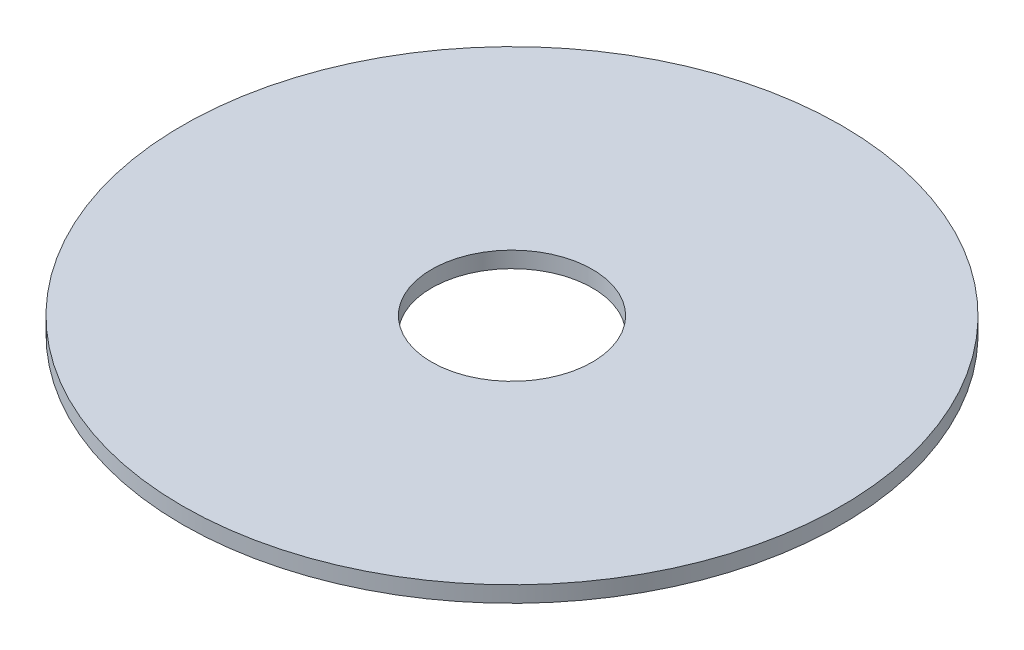
ISO-10303-21;
HEADER;
FILE_DESCRIPTION(('STEP AP214'),'2;1');
FILE_NAME('part.step','',(''),(''),'','','');
FILE_SCHEMA(('AUTOMOTIVE_DESIGN { 1 0 10303 214 1 1 1 1 }'));
ENDSEC;
DATA;
#1=APPLICATION_CONTEXT('core data for automotive mechanical design processes');
#2=APPLICATION_PROTOCOL_DEFINITION('international standard','automotive_design',2000,#1);
#3=PRODUCT_CONTEXT('',#1,'mechanical');
#4=PRODUCT('Part','Part','',(#3));
#5=PRODUCT_RELATED_PRODUCT_CATEGORY('part','',(#4));
#6=PRODUCT_DEFINITION_FORMATION('','',#4);
#7=PRODUCT_DEFINITION_CONTEXT('part definition',#1,'design');
#8=PRODUCT_DEFINITION('design','',#6,#7);
#9=PRODUCT_DEFINITION_SHAPE('','',#8);
#10=(LENGTH_UNIT() NAMED_UNIT(*) SI_UNIT(.MILLI.,.METRE.));
#11=(NAMED_UNIT(*) PLANE_ANGLE_UNIT() SI_UNIT($,.RADIAN.));
#12=(NAMED_UNIT(*) SI_UNIT($,.STERADIAN.) SOLID_ANGLE_UNIT());
#13=UNCERTAINTY_MEASURE_WITH_UNIT(LENGTH_MEASURE(1.E-05),#10,'distance_accuracy_value','');
#14=(GEOMETRIC_REPRESENTATION_CONTEXT(3) GLOBAL_UNCERTAINTY_ASSIGNED_CONTEXT((#13)) GLOBAL_UNIT_ASSIGNED_CONTEXT((#10,
#11,#12)) REPRESENTATION_CONTEXT('',''));
#15=CARTESIAN_POINT('',(0.,0.,0.));
#16=DIRECTION('',(0.,0.,1.));
#17=DIRECTION('',(1.,0.,0.));
#18=AXIS2_PLACEMENT_3D('',#15,#16,#17);
#19=CARTESIAN_POINT('',(0.,2.,0.));
#20=DIRECTION('',(0.,1.,0.));
#21=DIRECTION('',(0.,0.,1.));
#22=AXIS2_PLACEMENT_3D('',#19,#20,#21);
#23=PLANE('',#22);
#24=CARTESIAN_POINT('',(0.,2.,0.));
#25=DIRECTION('',(0.,1.,0.));
#26=DIRECTION('',(0.,0.,1.));
#27=AXIS2_PLACEMENT_3D('',#24,#25,#26);
#28=CIRCLE('',#27,41.);
#29=CARTESIAN_POINT('',(0.,2.,41.));
#30=VERTEX_POINT('',#29);
#31=EDGE_CURVE('E10',#30,#30,#28,.T.);
#32=ORIENTED_EDGE('',*,*,#31,.T.);
#33=EDGE_LOOP('',(#32));
#34=FACE_BOUND('',#33,.T.);
#35=CARTESIAN_POINT('',(0.,2.,0.));
#36=DIRECTION('',(0.,1.,0.));
#37=DIRECTION('',(0.,0.,1.));
#38=AXIS2_PLACEMENT_3D('',#35,#36,#37);
#39=CIRCLE('',#38,10.);
#40=CARTESIAN_POINT('',(0.,2.,10.));
#41=VERTEX_POINT('',#40);
#42=EDGE_CURVE('E42',#41,#41,#39,.T.);
#43=ORIENTED_EDGE('',*,*,#42,.F.);
#44=EDGE_LOOP('',(#43));
#45=FACE_BOUND('',#44,.T.);
#46=ADVANCED_FACE('F31',(#34,#45),#23,.T.);
#47=CARTESIAN_POINT('',(0.,0.,0.));
#48=DIRECTION('',(0.,1.,0.));
#49=DIRECTION('',(0.,0.,1.));
#50=AXIS2_PLACEMENT_3D('',#47,#48,#49);
#51=PLANE('',#50);
#52=CARTESIAN_POINT('',(0.,0.,0.));
#53=DIRECTION('',(0.,1.,0.));
#54=DIRECTION('',(0.,0.,1.));
#55=AXIS2_PLACEMENT_3D('',#52,#53,#54);
#56=CIRCLE('',#55,41.);
#57=CARTESIAN_POINT('',(0.,0.,41.));
#58=VERTEX_POINT('',#57);
#59=EDGE_CURVE('E35',#58,#58,#56,.T.);
#60=ORIENTED_EDGE('',*,*,#59,.F.);
#61=EDGE_LOOP('',(#60));
#62=FACE_BOUND('',#61,.T.);
#63=CARTESIAN_POINT('',(0.,0.,0.));
#64=DIRECTION('',(0.,1.,0.));
#65=DIRECTION('',(0.,0.,1.));
#66=AXIS2_PLACEMENT_3D('',#63,#64,#65);
#67=CIRCLE('',#66,10.);
#68=CARTESIAN_POINT('',(0.,0.,10.));
#69=VERTEX_POINT('',#68);
#70=EDGE_CURVE('E44',#69,#69,#67,.T.);
#71=ORIENTED_EDGE('',*,*,#70,.T.);
#72=EDGE_LOOP('',(#71));
#73=FACE_BOUND('',#72,.T.);
#74=ADVANCED_FACE('F54',(#62,#73),#51,.F.);
#75=CARTESIAN_POINT('',(0.,2.,0.));
#76=DIRECTION('',(0.,-1.,0.));
#77=DIRECTION('',(0.,0.,-1.));
#78=AXIS2_PLACEMENT_3D('',#75,#76,#77);
#79=CYLINDRICAL_SURFACE('',#78,41.);
#80=ORIENTED_EDGE('',*,*,#31,.F.);
#81=EDGE_LOOP('',(#80));
#82=FACE_BOUND('',#81,.T.);
#83=ORIENTED_EDGE('',*,*,#59,.T.);
#84=EDGE_LOOP('',(#83));
#85=FACE_BOUND('',#84,.T.);
#86=ADVANCED_FACE('F33',(#82,#85),#79,.T.);
#87=CARTESIAN_POINT('',(0.,2.,0.));
#88=DIRECTION('',(0.,-1.,0.));
#89=DIRECTION('',(0.,0.,-1.));
#90=AXIS2_PLACEMENT_3D('',#87,#88,#89);
#91=CYLINDRICAL_SURFACE('',#90,10.);
#92=ORIENTED_EDGE('',*,*,#42,.T.);
#93=EDGE_LOOP('',(#92));
#94=FACE_BOUND('',#93,.T.);
#95=ORIENTED_EDGE('',*,*,#70,.F.);
#96=EDGE_LOOP('',(#95));
#97=FACE_BOUND('',#96,.T.);
#98=ADVANCED_FACE('F50',(#94,#97),#91,.F.);
#99=CLOSED_SHELL('',(#46,#74,#86,#98));
#100=MANIFOLD_SOLID_BREP('B2',#99);
#101=ADVANCED_BREP_SHAPE_REPRESENTATION('',(#18,#100),#14);
#102=SHAPE_DEFINITION_REPRESENTATION(#9,#101);
ENDSEC;
END-ISO-10303-21;
